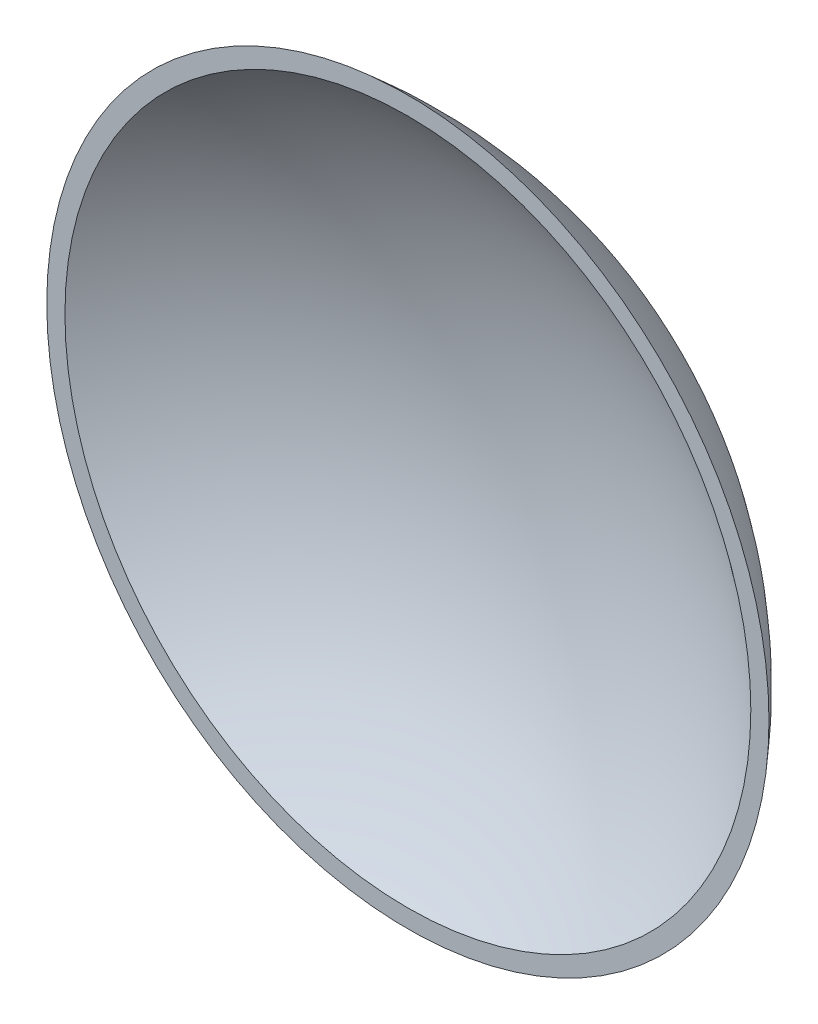
ISO-10303-21;
HEADER;
FILE_DESCRIPTION(('STEP AP214'),'2;1');
FILE_NAME('part.step','',(''),(''),'','','');
FILE_SCHEMA(('AUTOMOTIVE_DESIGN { 1 0 10303 214 1 1 1 1 }'));
ENDSEC;
DATA;
#1=APPLICATION_CONTEXT('core data for automotive mechanical design processes');
#2=APPLICATION_PROTOCOL_DEFINITION('international standard','automotive_design',2000,#1);
#3=PRODUCT_CONTEXT('',#1,'mechanical');
#4=PRODUCT('Part','Part','',(#3));
#5=PRODUCT_RELATED_PRODUCT_CATEGORY('part','',(#4));
#6=PRODUCT_DEFINITION_FORMATION('','',#4);
#7=PRODUCT_DEFINITION_CONTEXT('part definition',#1,'design');
#8=PRODUCT_DEFINITION('design','',#6,#7);
#9=PRODUCT_DEFINITION_SHAPE('','',#8);
#10=(LENGTH_UNIT() NAMED_UNIT(*) SI_UNIT(.MILLI.,.METRE.));
#11=(NAMED_UNIT(*) PLANE_ANGLE_UNIT() SI_UNIT($,.RADIAN.));
#12=(NAMED_UNIT(*) SI_UNIT($,.STERADIAN.) SOLID_ANGLE_UNIT());
#13=UNCERTAINTY_MEASURE_WITH_UNIT(LENGTH_MEASURE(1.E-05),#10,'distance_accuracy_value','');
#14=(GEOMETRIC_REPRESENTATION_CONTEXT(3) GLOBAL_UNCERTAINTY_ASSIGNED_CONTEXT((#13)) GLOBAL_UNIT_ASSIGNED_CONTEXT((#10,
#11,#12)) REPRESENTATION_CONTEXT('',''));
#15=CARTESIAN_POINT('',(0.,0.,0.));
#16=DIRECTION('',(0.,0.,1.));
#17=DIRECTION('',(1.,0.,0.));
#18=AXIS2_PLACEMENT_3D('',#15,#16,#17);
#19=CARTESIAN_POINT('',(0.,0.,40.0308433979499));
#20=DIRECTION('',(0.,0.,1.));
#21=DIRECTION('',(-1.,0.,0.));
#22=AXIS2_PLACEMENT_3D('',#19,#20,#21);
#23=SPHERICAL_SURFACE('',#22,66.3317335496929);
#24=CARTESIAN_POINT('',(0.,0.,-2.62192762231865));
#25=DIRECTION('',(0.,0.,1.));
#26=DIRECTION('',(1.,0.,0.));
#27=AXIS2_PLACEMENT_3D('',#24,#25,#26);
#28=CIRCLE('',#27,50.8);
#29=CARTESIAN_POINT('',(50.8,0.,-2.62192762231865));
#30=VERTEX_POINT('',#29);
#31=EDGE_CURVE('E10',#30,#30,#28,.T.);
#32=ORIENTED_EDGE('',*,*,#31,.F.);
#33=EDGE_LOOP('',(#32));
#34=FACE_BOUND('',#33,.T.);
#35=ADVANCED_FACE('F43',(#34),#23,.T.);
#36=CARTESIAN_POINT('',(-48.2448002501366,0.,-2.62192762231866));
#37=DIRECTION('',(0.,0.,-1.));
#38=DIRECTION('',(-1.,0.,0.));
#39=AXIS2_PLACEMENT_3D('',#36,#37,#38);
#40=PLANE('',#39);
#41=CARTESIAN_POINT('',(0.,0.,-2.62192762231867));
#42=DIRECTION('',(0.,0.,1.));
#43=DIRECTION('',(1.,0.,0.));
#44=AXIS2_PLACEMENT_3D('',#41,#42,#43);
#45=CIRCLE('',#44,48.2448002501365);
#46=CARTESIAN_POINT('',(48.2448002501365,0.,-2.62192762231867));
#47=VERTEX_POINT('',#46);
#48=EDGE_CURVE('E49',#47,#47,#45,.T.);
#49=ORIENTED_EDGE('',*,*,#48,.F.);
#50=EDGE_LOOP('',(#49));
#51=FACE_BOUND('',#50,.T.);
#52=ORIENTED_EDGE('',*,*,#31,.T.);
#53=EDGE_LOOP('',(#52));
#54=FACE_BOUND('',#53,.T.);
#55=ADVANCED_FACE('F57',(#51,#54),#40,.F.);
#56=CARTESIAN_POINT('',(0.,0.,56.3600971718881));
#57=DIRECTION('',(0.,0.,1.));
#58=DIRECTION('',(-1.,0.,0.));
#59=AXIS2_PLACEMENT_3D('',#56,#57,#58);
#60=SPHERICAL_SURFACE('',#59,76.2);
#61=ORIENTED_EDGE('',*,*,#48,.T.);
#62=EDGE_LOOP('',(#61));
#63=FACE_BOUND('',#62,.T.);
#64=ADVANCED_FACE('F55',(#63),#60,.F.);
#65=CLOSED_SHELL('',(#35,#55,#64));
#66=MANIFOLD_SOLID_BREP('B2',#65);
#67=ADVANCED_BREP_SHAPE_REPRESENTATION('',(#18,#66),#14);
#68=SHAPE_DEFINITION_REPRESENTATION(#9,#67);
ENDSEC;
END-ISO-10303-21;
